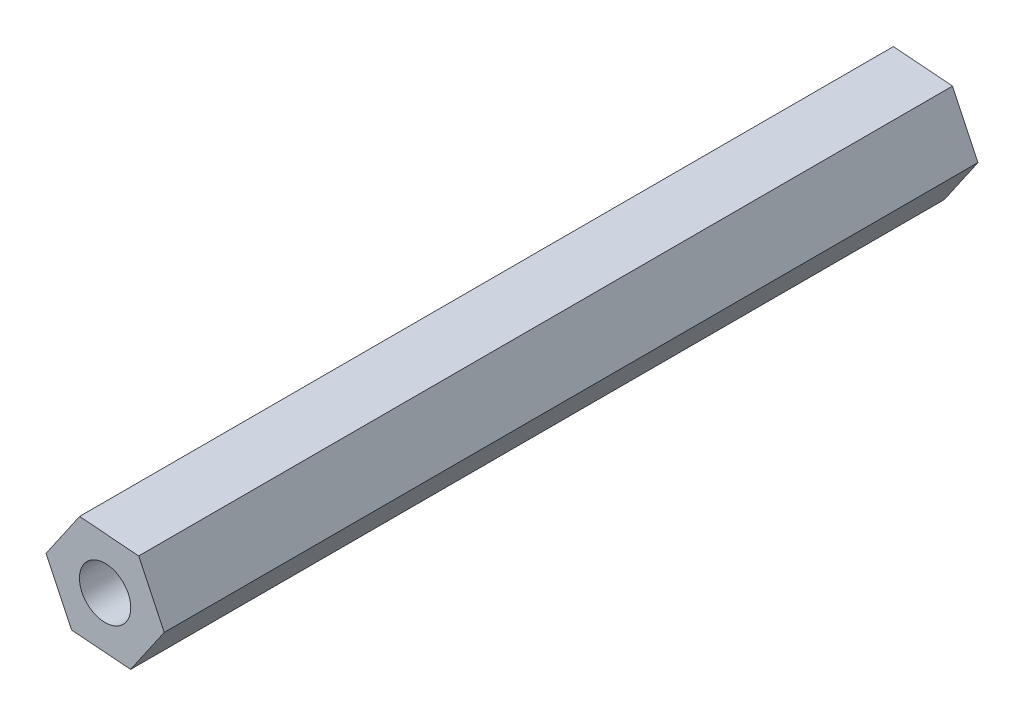
ISO-10303-21;
HEADER;
FILE_DESCRIPTION(('STEP AP214'),'2;1');
FILE_NAME('part.step','',(''),(''),'','','');
FILE_SCHEMA(('AUTOMOTIVE_DESIGN { 1 0 10303 214 1 1 1 1 }'));
ENDSEC;
DATA;
#1=APPLICATION_CONTEXT('core data for automotive mechanical design processes');
#2=APPLICATION_PROTOCOL_DEFINITION('international standard','automotive_design',2000,#1);
#3=PRODUCT_CONTEXT('',#1,'mechanical');
#4=PRODUCT('Part','Part','',(#3));
#5=PRODUCT_RELATED_PRODUCT_CATEGORY('part','',(#4));
#6=PRODUCT_DEFINITION_FORMATION('','',#4);
#7=PRODUCT_DEFINITION_CONTEXT('part definition',#1,'design');
#8=PRODUCT_DEFINITION('design','',#6,#7);
#9=PRODUCT_DEFINITION_SHAPE('','',#8);
#10=(LENGTH_UNIT() NAMED_UNIT(*) SI_UNIT(.MILLI.,.METRE.));
#11=(NAMED_UNIT(*) PLANE_ANGLE_UNIT() SI_UNIT($,.RADIAN.));
#12=(NAMED_UNIT(*) SI_UNIT($,.STERADIAN.) SOLID_ANGLE_UNIT());
#13=UNCERTAINTY_MEASURE_WITH_UNIT(LENGTH_MEASURE(1.E-05),#10,'distance_accuracy_value','');
#14=(GEOMETRIC_REPRESENTATION_CONTEXT(3) GLOBAL_UNCERTAINTY_ASSIGNED_CONTEXT((#13)) GLOBAL_UNIT_ASSIGNED_CONTEXT((#10,
#11,#12)) REPRESENTATION_CONTEXT('',''));
#15=CARTESIAN_POINT('',(0.,0.,0.));
#16=DIRECTION('',(0.,0.,1.));
#17=DIRECTION('',(1.,0.,0.));
#18=AXIS2_PLACEMENT_3D('',#15,#16,#17);
#19=CARTESIAN_POINT('',(0.,0.,65.));
#20=DIRECTION('',(0.,0.,1.));
#21=DIRECTION('',(1.,0.,0.));
#22=AXIS2_PLACEMENT_3D('',#19,#20,#21);
#23=PLANE('',#22);
#24=DIRECTION('',(-0.996887505256506,0.0788371857911004,0.));
#25=VECTOR('',#24,1.);
#26=CARTESIAN_POINT('',(2.68300086674115,3.90062042275323,65.));
#27=LINE('',#26,#25);
#28=CARTESIAN_POINT('',(2.68300086674115,3.90062042275323,65.));
#29=VERTEX_POINT('',#28);
#30=CARTESIAN_POINT('',(-2.03653594325412,4.27385712035011,65.));
#31=VERTEX_POINT('',#30);
#32=EDGE_CURVE('E135',#29,#31,#27,.T.);
#33=ORIENTED_EDGE('',*,*,#32,.T.);
#34=DIRECTION('',(-0.566718758286219,-0.823911311371877,0.));
#35=VECTOR('',#34,1.);
#36=CARTESIAN_POINT('',(-2.03653594325412,4.27385712035011,65.));
#37=LINE('',#36,#35);
#38=CARTESIAN_POINT('',(-4.71953680999527,0.373236697596884,65.));
#39=VERTEX_POINT('',#38);
#40=EDGE_CURVE('E93',#31,#39,#37,.T.);
#41=ORIENTED_EDGE('',*,*,#40,.T.);
#42=DIRECTION('',(0.430168746970286,-0.902748497162977,0.));
#43=VECTOR('',#42,1.);
#44=CARTESIAN_POINT('',(-4.71953680999527,0.373236697596884,65.));
#45=LINE('',#44,#43);
#46=CARTESIAN_POINT('',(-2.68300086674115,-3.90062042275323,65.));
#47=VERTEX_POINT('',#46);
#48=EDGE_CURVE('E106',#39,#47,#45,.T.);
#49=ORIENTED_EDGE('',*,*,#48,.T.);
#50=DIRECTION('',(0.996887505256506,-0.0788371857911006,0.));
#51=VECTOR('',#50,1.);
#52=CARTESIAN_POINT('',(-2.68300086674115,-3.90062042275323,65.));
#53=LINE('',#52,#51);
#54=CARTESIAN_POINT('',(2.03653594325412,-4.27385712035012,65.));
#55=VERTEX_POINT('',#54);
#56=EDGE_CURVE('E100',#47,#55,#53,.T.);
#57=ORIENTED_EDGE('',*,*,#56,.T.);
#58=DIRECTION('',(0.566718758286219,0.823911311371877,0.));
#59=VECTOR('',#58,1.);
#60=CARTESIAN_POINT('',(2.03653594325412,-4.27385712035012,65.));
#61=LINE('',#60,#59);
#62=CARTESIAN_POINT('',(4.71953680999527,-0.373236697596885,65.));
#63=VERTEX_POINT('',#62);
#64=EDGE_CURVE('E104',#55,#63,#61,.T.);
#65=ORIENTED_EDGE('',*,*,#64,.T.);
#66=DIRECTION('',(-0.430168746970286,0.902748497162977,0.));
#67=VECTOR('',#66,1.);
#68=CARTESIAN_POINT('',(4.71953680999527,-0.373236697596885,65.));
#69=LINE('',#68,#67);
#70=EDGE_CURVE('E56',#63,#29,#69,.T.);
#71=ORIENTED_EDGE('',*,*,#70,.T.);
#72=EDGE_LOOP('',(#33,#41,#49,#57,#65,#71));
#73=FACE_BOUND('',#72,.T.);
#74=CARTESIAN_POINT('',(0.,0.,65.));
#75=DIRECTION('',(0.,0.,1.));
#76=DIRECTION('',(1.,0.,0.));
#77=AXIS2_PLACEMENT_3D('',#74,#75,#76);
#78=CIRCLE('',#77,2.05);
#79=CARTESIAN_POINT('',(2.05,0.,65.));
#80=VERTEX_POINT('',#79);
#81=EDGE_CURVE('E128',#80,#80,#78,.T.);
#82=ORIENTED_EDGE('',*,*,#81,.F.);
#83=EDGE_LOOP('',(#82));
#84=FACE_BOUND('',#83,.T.);
#85=ADVANCED_FACE('F39',(#73,#84),#23,.T.);
#86=CARTESIAN_POINT('',(0.,0.,0.));
#87=DIRECTION('',(0.,0.,1.));
#88=DIRECTION('',(1.,0.,0.));
#89=AXIS2_PLACEMENT_3D('',#86,#87,#88);
#90=PLANE('',#89);
#91=DIRECTION('',(-0.996887505256506,0.0788371857911004,0.));
#92=VECTOR('',#91,1.);
#93=CARTESIAN_POINT('',(2.68300086674115,3.90062042275323,0.));
#94=LINE('',#93,#92);
#95=CARTESIAN_POINT('',(2.68300086674115,3.90062042275323,0.));
#96=VERTEX_POINT('',#95);
#97=CARTESIAN_POINT('',(-2.03653594325412,4.27385712035011,0.));
#98=VERTEX_POINT('',#97);
#99=EDGE_CURVE('E124',#96,#98,#94,.T.);
#100=ORIENTED_EDGE('',*,*,#99,.F.);
#101=DIRECTION('',(-0.430168746970286,0.902748497162977,0.));
#102=VECTOR('',#101,1.);
#103=CARTESIAN_POINT('',(4.71953680999527,-0.373236697596885,0.));
#104=LINE('',#103,#102);
#105=CARTESIAN_POINT('',(4.71953680999527,-0.373236697596885,0.));
#106=VERTEX_POINT('',#105);
#107=EDGE_CURVE('E85',#106,#96,#104,.T.);
#108=ORIENTED_EDGE('',*,*,#107,.F.);
#109=DIRECTION('',(0.566718758286219,0.823911311371877,0.));
#110=VECTOR('',#109,1.);
#111=CARTESIAN_POINT('',(2.03653594325412,-4.27385712035012,0.));
#112=LINE('',#111,#110);
#113=CARTESIAN_POINT('',(2.03653594325412,-4.27385712035012,0.));
#114=VERTEX_POINT('',#113);
#115=EDGE_CURVE('E79',#114,#106,#112,.T.);
#116=ORIENTED_EDGE('',*,*,#115,.F.);
#117=DIRECTION('',(0.996887505256506,-0.0788371857911006,0.));
#118=VECTOR('',#117,1.);
#119=CARTESIAN_POINT('',(-2.68300086674115,-3.90062042275323,0.));
#120=LINE('',#119,#118);
#121=CARTESIAN_POINT('',(-2.68300086674115,-3.90062042275323,0.));
#122=VERTEX_POINT('',#121);
#123=EDGE_CURVE('E114',#122,#114,#120,.T.);
#124=ORIENTED_EDGE('',*,*,#123,.F.);
#125=DIRECTION('',(0.430168746970286,-0.902748497162977,0.));
#126=VECTOR('',#125,1.);
#127=CARTESIAN_POINT('',(-4.71953680999527,0.373236697596884,0.));
#128=LINE('',#127,#126);
#129=CARTESIAN_POINT('',(-4.71953680999527,0.373236697596884,0.));
#130=VERTEX_POINT('',#129);
#131=EDGE_CURVE('E130',#130,#122,#128,.T.);
#132=ORIENTED_EDGE('',*,*,#131,.F.);
#133=DIRECTION('',(-0.566718758286219,-0.823911311371877,0.));
#134=VECTOR('',#133,1.);
#135=CARTESIAN_POINT('',(-2.03653594325412,4.27385712035011,0.));
#136=LINE('',#135,#134);
#137=EDGE_CURVE('E127',#98,#130,#136,.T.);
#138=ORIENTED_EDGE('',*,*,#137,.F.);
#139=EDGE_LOOP('',(#100,#108,#116,#124,#132,#138));
#140=FACE_BOUND('',#139,.T.);
#141=CARTESIAN_POINT('',(0.,0.,0.));
#142=DIRECTION('',(0.,0.,1.));
#143=DIRECTION('',(1.,0.,0.));
#144=AXIS2_PLACEMENT_3D('',#141,#142,#143);
#145=CIRCLE('',#144,2.05);
#146=CARTESIAN_POINT('',(2.05,0.,0.));
#147=VERTEX_POINT('',#146);
#148=EDGE_CURVE('E228',#147,#147,#145,.T.);
#149=ORIENTED_EDGE('',*,*,#148,.T.);
#150=EDGE_LOOP('',(#149));
#151=FACE_BOUND('',#150,.T.);
#152=ADVANCED_FACE('F144',(#140,#151),#90,.F.);
#153=CARTESIAN_POINT('',(2.68300086674115,3.90062042275323,65.));
#154=DIRECTION('',(-0.0788371857911004,-0.996887505256506,0.));
#155=DIRECTION('',(0.996887505256506,-0.0788371857911004,0.));
#156=AXIS2_PLACEMENT_3D('',#153,#154,#155);
#157=PLANE('',#156);
#158=ORIENTED_EDGE('',*,*,#99,.T.);
#159=DIRECTION('',(0.,0.,-1.));
#160=VECTOR('',#159,1.);
#161=CARTESIAN_POINT('',(-2.03653594325412,4.27385712035011,65.));
#162=LINE('',#161,#160);
#163=EDGE_CURVE('E11',#31,#98,#162,.T.);
#164=ORIENTED_EDGE('',*,*,#163,.F.);
#165=ORIENTED_EDGE('',*,*,#32,.F.);
#166=DIRECTION('',(0.,0.,-1.));
#167=VECTOR('',#166,1.);
#168=CARTESIAN_POINT('',(2.68300086674115,3.90062042275323,65.));
#169=LINE('',#168,#167);
#170=EDGE_CURVE('E120',#29,#96,#169,.T.);
#171=ORIENTED_EDGE('',*,*,#170,.T.);
#172=EDGE_LOOP('',(#158,#164,#165,#171));
#173=FACE_BOUND('',#172,.T.);
#174=ADVANCED_FACE('F41',(#173),#157,.F.);
#175=CARTESIAN_POINT('',(-2.03653594325412,4.27385712035011,65.));
#176=DIRECTION('',(0.823911311371877,-0.566718758286219,0.));
#177=DIRECTION('',(0.566718758286219,0.823911311371877,0.));
#178=AXIS2_PLACEMENT_3D('',#175,#176,#177);
#179=PLANE('',#178);
#180=ORIENTED_EDGE('',*,*,#137,.T.);
#181=DIRECTION('',(0.,0.,-1.));
#182=VECTOR('',#181,1.);
#183=CARTESIAN_POINT('',(-4.71953680999527,0.373236697596884,65.));
#184=LINE('',#183,#182);
#185=EDGE_CURVE('E48',#39,#130,#184,.T.);
#186=ORIENTED_EDGE('',*,*,#185,.F.);
#187=ORIENTED_EDGE('',*,*,#40,.F.);
#188=ORIENTED_EDGE('',*,*,#163,.T.);
#189=EDGE_LOOP('',(#180,#186,#187,#188));
#190=FACE_BOUND('',#189,.T.);
#191=ADVANCED_FACE('F169',(#190),#179,.F.);
#192=CARTESIAN_POINT('',(-4.71953680999527,0.373236697596884,65.));
#193=DIRECTION('',(0.902748497162977,0.430168746970286,0.));
#194=DIRECTION('',(-0.430168746970286,0.902748497162977,0.));
#195=AXIS2_PLACEMENT_3D('',#192,#193,#194);
#196=PLANE('',#195);
#197=ORIENTED_EDGE('',*,*,#131,.T.);
#198=DIRECTION('',(0.,0.,-1.));
#199=VECTOR('',#198,1.);
#200=CARTESIAN_POINT('',(-2.68300086674115,-3.90062042275323,65.));
#201=LINE('',#200,#199);
#202=EDGE_CURVE('E115',#47,#122,#201,.T.);
#203=ORIENTED_EDGE('',*,*,#202,.F.);
#204=ORIENTED_EDGE('',*,*,#48,.F.);
#205=ORIENTED_EDGE('',*,*,#185,.T.);
#206=EDGE_LOOP('',(#197,#203,#204,#205));
#207=FACE_BOUND('',#206,.T.);
#208=ADVANCED_FACE('F141',(#207),#196,.F.);
#209=CARTESIAN_POINT('',(-2.68300086674115,-3.90062042275323,65.));
#210=DIRECTION('',(0.0788371857911006,0.996887505256505,0.));
#211=DIRECTION('',(-0.996887505256506,0.0788371857911006,0.));
#212=AXIS2_PLACEMENT_3D('',#209,#210,#211);
#213=PLANE('',#212);
#214=ORIENTED_EDGE('',*,*,#123,.T.);
#215=DIRECTION('',(0.,0.,-1.));
#216=VECTOR('',#215,1.);
#217=CARTESIAN_POINT('',(2.03653594325412,-4.27385712035012,65.));
#218=LINE('',#217,#216);
#219=EDGE_CURVE('E111',#55,#114,#218,.T.);
#220=ORIENTED_EDGE('',*,*,#219,.F.);
#221=ORIENTED_EDGE('',*,*,#56,.F.);
#222=ORIENTED_EDGE('',*,*,#202,.T.);
#223=EDGE_LOOP('',(#214,#220,#221,#222));
#224=FACE_BOUND('',#223,.T.);
#225=ADVANCED_FACE('F112',(#224),#213,.F.);
#226=CARTESIAN_POINT('',(2.03653594325412,-4.27385712035012,65.));
#227=DIRECTION('',(-0.823911311371877,0.566718758286219,0.));
#228=DIRECTION('',(-0.566718758286219,-0.823911311371877,0.));
#229=AXIS2_PLACEMENT_3D('',#226,#227,#228);
#230=PLANE('',#229);
#231=ORIENTED_EDGE('',*,*,#115,.T.);
#232=DIRECTION('',(0.,0.,-1.));
#233=VECTOR('',#232,1.);
#234=CARTESIAN_POINT('',(4.71953680999527,-0.373236697596885,65.));
#235=LINE('',#234,#233);
#236=EDGE_CURVE('E116',#63,#106,#235,.T.);
#237=ORIENTED_EDGE('',*,*,#236,.F.);
#238=ORIENTED_EDGE('',*,*,#64,.F.);
#239=ORIENTED_EDGE('',*,*,#219,.T.);
#240=EDGE_LOOP('',(#231,#237,#238,#239));
#241=FACE_BOUND('',#240,.T.);
#242=ADVANCED_FACE('F118',(#241),#230,.F.);
#243=CARTESIAN_POINT('',(4.71953680999527,-0.373236697596885,65.));
#244=DIRECTION('',(-0.902748497162977,-0.430168746970286,0.));
#245=DIRECTION('',(0.430168746970286,-0.902748497162977,0.));
#246=AXIS2_PLACEMENT_3D('',#243,#244,#245);
#247=PLANE('',#246);
#248=ORIENTED_EDGE('',*,*,#107,.T.);
#249=ORIENTED_EDGE('',*,*,#170,.F.);
#250=ORIENTED_EDGE('',*,*,#70,.F.);
#251=ORIENTED_EDGE('',*,*,#236,.T.);
#252=EDGE_LOOP('',(#248,#249,#250,#251));
#253=FACE_BOUND('',#252,.T.);
#254=ADVANCED_FACE('F149',(#253),#247,.F.);
#255=CARTESIAN_POINT('',(0.,0.,65.));
#256=DIRECTION('',(0.,0.,-1.));
#257=DIRECTION('',(-1.,0.,0.));
#258=AXIS2_PLACEMENT_3D('',#255,#256,#257);
#259=CYLINDRICAL_SURFACE('',#258,2.05);
#260=ORIENTED_EDGE('',*,*,#81,.T.);
#261=EDGE_LOOP('',(#260));
#262=FACE_BOUND('',#261,.T.);
#263=ORIENTED_EDGE('',*,*,#148,.F.);
#264=EDGE_LOOP('',(#263));
#265=FACE_BOUND('',#264,.T.);
#266=ADVANCED_FACE('F151',(#262,#265),#259,.F.);
#267=CLOSED_SHELL('',(#85,#152,#174,#191,#208,#225,#242,#254,#266));
#268=MANIFOLD_SOLID_BREP('B2',#267);
#269=ADVANCED_BREP_SHAPE_REPRESENTATION('',(#18,#268),#14);
#270=SHAPE_DEFINITION_REPRESENTATION(#9,#269);
ENDSEC;
END-ISO-10303-21;
